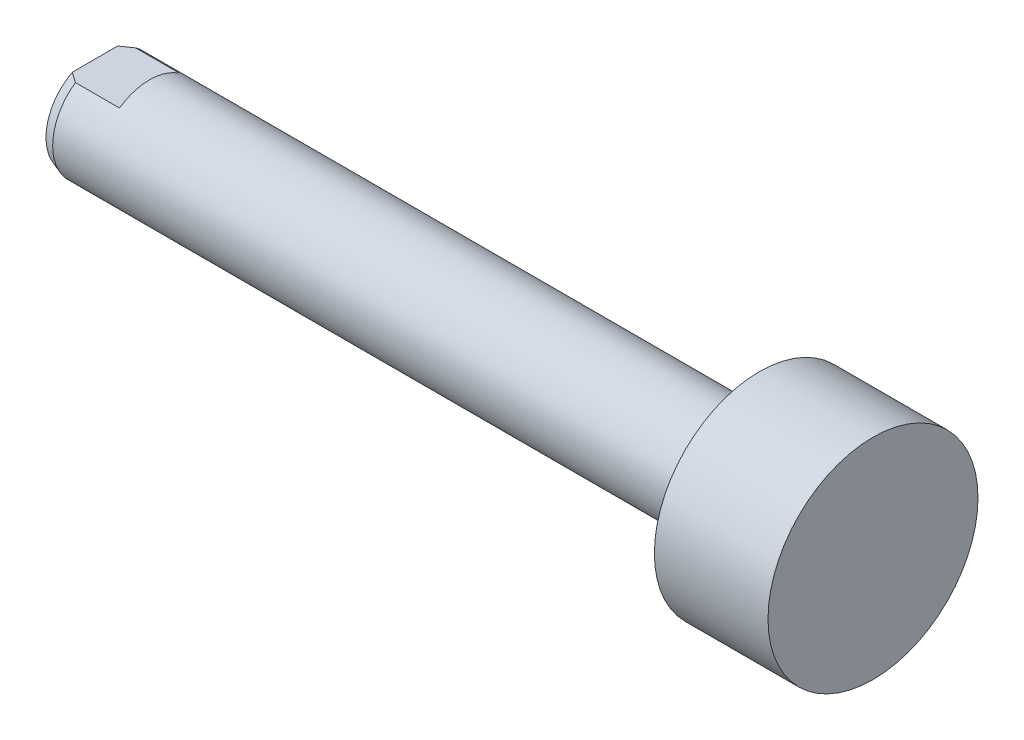
ISO-10303-21;
HEADER;
FILE_DESCRIPTION(('STEP AP214'),'2;1');
FILE_NAME('part.step','',(''),(''),'','','');
FILE_SCHEMA(('AUTOMOTIVE_DESIGN { 1 0 10303 214 1 1 1 1 }'));
ENDSEC;
DATA;
#1=APPLICATION_CONTEXT('core data for automotive mechanical design processes');
#2=APPLICATION_PROTOCOL_DEFINITION('international standard','automotive_design',2000,#1);
#3=PRODUCT_CONTEXT('',#1,'mechanical');
#4=PRODUCT('Part','Part','',(#3));
#5=PRODUCT_RELATED_PRODUCT_CATEGORY('part','',(#4));
#6=PRODUCT_DEFINITION_FORMATION('','',#4);
#7=PRODUCT_DEFINITION_CONTEXT('part definition',#1,'design');
#8=PRODUCT_DEFINITION('design','',#6,#7);
#9=PRODUCT_DEFINITION_SHAPE('','',#8);
#10=(LENGTH_UNIT() NAMED_UNIT(*) SI_UNIT(.MILLI.,.METRE.));
#11=(NAMED_UNIT(*) PLANE_ANGLE_UNIT() SI_UNIT($,.RADIAN.));
#12=(NAMED_UNIT(*) SI_UNIT($,.STERADIAN.) SOLID_ANGLE_UNIT());
#13=UNCERTAINTY_MEASURE_WITH_UNIT(LENGTH_MEASURE(1.E-05),#10,'distance_accuracy_value','');
#14=(GEOMETRIC_REPRESENTATION_CONTEXT(3) GLOBAL_UNCERTAINTY_ASSIGNED_CONTEXT((#13)) GLOBAL_UNIT_ASSIGNED_CONTEXT((#10,
#11,#12)) REPRESENTATION_CONTEXT('',''));
#15=CARTESIAN_POINT('',(0.,0.,0.));
#16=DIRECTION('',(0.,0.,1.));
#17=DIRECTION('',(1.,0.,0.));
#18=AXIS2_PLACEMENT_3D('',#15,#16,#17);
#19=CARTESIAN_POINT('',(2.11328000006006,0.,0.));
#20=DIRECTION('',(-1.,0.,0.));
#21=DIRECTION('',(0.,0.,1.));
#22=AXIS2_PLACEMENT_3D('',#19,#20,#21);
#23=CONICAL_SURFACE('',#22,1.22949999996536,1.04719755108378);
#24=CARTESIAN_POINT('',(2.8231321560952,8.5265128291212E-11,0.));
#25=VERTEX_POINT('',#24);
#26=VERTEX_LOOP('',#25);
#27=FACE_BOUND('',#26,.T.);
#28=CARTESIAN_POINT('',(2.11328,0.,0.));
#29=DIRECTION('',(1.,0.,0.));
#30=DIRECTION('',(0.,0.,-1.));
#31=AXIS2_PLACEMENT_3D('',#28,#29,#30);
#32=CIRCLE('',#31,1.2295);
#33=CARTESIAN_POINT('',(2.11328,0.,-1.2295));
#34=VERTEX_POINT('',#33);
#35=EDGE_CURVE('E77',#34,#34,#32,.F.);
#36=ORIENTED_EDGE('',*,*,#35,.T.);
#37=EDGE_LOOP('',(#36));
#38=FACE_BOUND('',#37,.T.);
#39=ADVANCED_FACE('F16',(#27,#38),#23,.F.);
#40=CARTESIAN_POINT('',(-1.34811,0.,0.));
#41=DIRECTION('',(1.,0.,0.));
#42=DIRECTION('',(0.,0.,-1.));
#43=AXIS2_PLACEMENT_3D('',#40,#41,#42);
#44=CYLINDRICAL_SURFACE('',#43,1.2295);
#45=CARTESIAN_POINT('',(-4.80950000002167,0.,0.));
#46=DIRECTION('',(-1.,0.,0.));
#47=DIRECTION('',(0.,1.,0.));
#48=AXIS2_PLACEMENT_3D('',#45,#46,#47);
#49=CIRCLE('',#48,1.2295000000222);
#50=CARTESIAN_POINT('',(-4.80950000002167,1.2295000000222,0.));
#51=VERTEX_POINT('',#50);
#52=EDGE_CURVE('E79',#51,#51,#49,.T.);
#53=ORIENTED_EDGE('',*,*,#52,.T.);
#54=EDGE_LOOP('',(#53));
#55=FACE_BOUND('',#54,.T.);
#56=ORIENTED_EDGE('',*,*,#35,.F.);
#57=EDGE_LOOP('',(#56));
#58=FACE_BOUND('',#57,.T.);
#59=ADVANCED_FACE('F74',(#55,#58),#44,.F.);
#60=CARTESIAN_POINT('',(39.09695,2.98094999999999,0.));
#61=DIRECTION('',(1.,0.,0.));
#62=DIRECTION('',(0.,0.,-1.));
#63=AXIS2_PLACEMENT_3D('',#60,#61,#62);
#64=PLANE('',#63);
#65=CARTESIAN_POINT('',(39.09695,0.,0.));
#66=DIRECTION('',(1.,0.,0.));
#67=DIRECTION('',(0.,0.,-1.));
#68=AXIS2_PLACEMENT_3D('',#65,#66,#67);
#69=CIRCLE('',#68,5.9619);
#70=CARTESIAN_POINT('',(39.09695,0.,-5.9619));
#71=VERTEX_POINT('',#70);
#72=EDGE_CURVE('E19',#71,#71,#69,.F.);
#73=ORIENTED_EDGE('',*,*,#72,.F.);
#74=EDGE_LOOP('',(#73));
#75=FACE_BOUND('',#74,.T.);
#76=ADVANCED_FACE('F138',(#75),#64,.T.);
#77=CARTESIAN_POINT('',(-5.08000000002085,0.,0.));
#78=DIRECTION('',(-1.,0.,0.));
#79=DIRECTION('',(0.,0.,1.));
#80=AXIS2_PLACEMENT_3D('',#77,#78,#79);
#81=CONICAL_SURFACE('',#80,1.50000000002137,0.785398163397448);
#82=CARTESIAN_POINT('',(-5.08000000002085,0.,0.));
#83=DIRECTION('',(-1.,0.,0.));
#84=DIRECTION('',(0.,0.,1.));
#85=AXIS2_PLACEMENT_3D('',#82,#83,#84);
#86=CIRCLE('',#85,1.50000000002137);
#87=CARTESIAN_POINT('',(-5.08000000002085,0.,1.50000000002137));
#88=VERTEX_POINT('',#87);
#89=EDGE_CURVE('E103',#88,#88,#86,.F.);
#90=ORIENTED_EDGE('',*,*,#89,.F.);
#91=EDGE_LOOP('',(#90));
#92=FACE_BOUND('',#91,.T.);
#93=ORIENTED_EDGE('',*,*,#52,.F.);
#94=EDGE_LOOP('',(#93));
#95=FACE_BOUND('',#94,.T.);
#96=ADVANCED_FACE('F134',(#92,#95),#81,.F.);
#97=CARTESIAN_POINT('',(35.87115,0.,0.));
#98=DIRECTION('',(1.,0.,0.));
#99=DIRECTION('',(0.,0.,-1.));
#100=AXIS2_PLACEMENT_3D('',#97,#98,#99);
#101=CYLINDRICAL_SURFACE('',#100,5.9619);
#102=CARTESIAN_POINT('',(32.64535,0.,0.));
#103=DIRECTION('',(1.,0.,0.));
#104=DIRECTION('',(0.,0.,-1.));
#105=AXIS2_PLACEMENT_3D('',#102,#103,#104);
#106=CIRCLE('',#105,5.9619);
#107=CARTESIAN_POINT('',(32.64535,0.,-5.9619));
#108=VERTEX_POINT('',#107);
#109=EDGE_CURVE('E97',#108,#108,#106,.F.);
#110=ORIENTED_EDGE('',*,*,#109,.F.);
#111=EDGE_LOOP('',(#110));
#112=FACE_BOUND('',#111,.T.);
#113=ORIENTED_EDGE('',*,*,#72,.T.);
#114=EDGE_LOOP('',(#113));
#115=FACE_BOUND('',#114,.T.);
#116=ADVANCED_FACE('F129',(#112,#115),#101,.T.);
#117=CARTESIAN_POINT('',(-4.48329518582113,0.,0.));
#118=DIRECTION('',(1.,0.,0.));
#119=DIRECTION('',(0.,0.,-1.));
#120=AXIS2_PLACEMENT_3D('',#117,#118,#119);
#121=CONICAL_SURFACE('',#120,2.99720000001003,0.349065850407162);
#122=CARTESIAN_POINT('',(-4.48329518582113,2.46380000000824,1.70672124262267));
#123=CARTESIAN_POINT('',(-4.51097913225117,2.46380000672184,1.68902577354891));
#124=CARTESIAN_POINT('',(-4.53857947804352,2.46380000758425,1.6711989698207));
#125=CARTESIAN_POINT('',(-4.59299465106385,2.46379998808494,1.63565422581739));
#126=CARTESIAN_POINT('',(-4.61981347488522,2.46379996818603,1.6179424017832));
#127=CARTESIAN_POINT('',(-4.6726658415024,2.46379989952958,1.58262352310495));
#128=CARTESIAN_POINT('',(-4.69870362829504,2.46379985142043,1.56502282422495));
#129=CARTESIAN_POINT('',(-4.74999352945157,2.46379975252432,1.52992132298173));
#130=CARTESIAN_POINT('',(-4.77525016731626,2.46379970182161,1.51242713384378));
#131=CARTESIAN_POINT('',(-4.82497753678573,2.46379962915132,1.47753368893592));
#132=CARTESIAN_POINT('',(-4.84945308740282,2.4637996065571,1.46014130547872));
#133=CARTESIAN_POINT('',(-4.8976179161575,2.46379961079501,1.42544618405401));
#134=CARTESIAN_POINT('',(-4.92131233208845,2.46379963650245,1.40815058252513));
#135=CARTESIAN_POINT('',(-4.96791477296314,2.46379973594677,1.37364366027284));
#136=CARTESIAN_POINT('',(-4.99082826971789,2.46379980855252,1.35643973728343));
#137=CARTESIAN_POINT('',(-5.03586779935474,2.46379993363123,1.32210998243675));
#138=CARTESIAN_POINT('',(-5.05799968162426,2.46379998653734,1.3049918214378));
#139=CARTESIAN_POINT('',(-5.07999999996649,2.46380000002124,1.28770541751564));
#140=B_SPLINE_CURVE_WITH_KNOTS('',3,(#122,#123,#124,#125,#126,#127,#128,#129,#130,#131,#132,
#133,#134,#135,#136,#137,#138,#139),.UNSPECIFIED.,.F.,.F.,(4,2,2,2,2,2,2,2,4),(0.,
0.0985686869377982,0.194986004301154,0.289269581323357,0.381438527237303,0.471513562401373,
0.559517161624862,0.645473710664596,0.729409676852239),.UNSPECIFIED.);
#141=CARTESIAN_POINT('',(-4.48329518581104,2.46380000000412,1.70672124261982));
#142=VERTEX_POINT('',#141);
#143=CARTESIAN_POINT('',(-5.07999999996524,2.46380000001062,1.28770541753693));
#144=VERTEX_POINT('',#143);
#145=EDGE_CURVE('E105',#142,#144,#140,.T.);
#146=ORIENTED_EDGE('',*,*,#145,.T.);
#147=CARTESIAN_POINT('',(-5.079999999964,0.,0.));
#148=DIRECTION('',(1.,0.,0.));
#149=DIRECTION('',(0.,0.,-1.));
#150=AXIS2_PLACEMENT_3D('',#147,#148,#149);
#151=CIRCLE('',#150,2.78001720901307);
#152=CARTESIAN_POINT('',(-5.07999999996524,-2.46380000001062,1.28770541753694));
#153=VERTEX_POINT('',#152);
#154=EDGE_CURVE('E101',#153,#144,#151,.F.);
#155=ORIENTED_EDGE('',*,*,#154,.F.);
#156=CARTESIAN_POINT('',(-5.07999999996649,-2.46380000002124,1.28770541751564));
#157=CARTESIAN_POINT('',(-5.05799968162427,-2.46379998653733,1.30499182143781));
#158=CARTESIAN_POINT('',(-5.03586779935475,-2.46379993363123,1.32210998243675));
#159=CARTESIAN_POINT('',(-4.99082826971789,-2.46379980855252,1.35643973728343));
#160=CARTESIAN_POINT('',(-4.96791477296314,-2.46379973594677,1.37364366027285));
#161=CARTESIAN_POINT('',(-4.92131233208845,-2.46379963650245,1.40815058252513));
#162=CARTESIAN_POINT('',(-4.8976179161575,-2.46379961079501,1.42544618405401));
#163=CARTESIAN_POINT('',(-4.84945308740282,-2.46379960655709,1.46014130547872));
#164=CARTESIAN_POINT('',(-4.82497753678573,-2.46379962915132,1.47753368893592));
#165=CARTESIAN_POINT('',(-4.77525016731626,-2.46379970182161,1.51242713384378));
#166=CARTESIAN_POINT('',(-4.74999352945157,-2.46379975252432,1.52992132298173));
#167=CARTESIAN_POINT('',(-4.69870362829504,-2.46379985142043,1.56502282422495));
#168=CARTESIAN_POINT('',(-4.6726658415024,-2.46379989952958,1.58262352310495));
#169=CARTESIAN_POINT('',(-4.61981347488522,-2.46379996818603,1.6179424017832));
#170=CARTESIAN_POINT('',(-4.59299465106385,-2.46379998808494,1.63565422581739));
#171=CARTESIAN_POINT('',(-4.53857947804352,-2.46380000758425,1.6711989698207));
#172=CARTESIAN_POINT('',(-4.51097913225117,-2.46380000672184,1.68902577354891));
#173=CARTESIAN_POINT('',(-4.48329518582113,-2.46380000000824,1.70672124262267));
#174=B_SPLINE_CURVE_WITH_KNOTS('',3,(#156,#157,#158,#159,#160,#161,#162,#163,#164,#165,#166,
#167,#168,#169,#170,#171,#172,#173),.UNSPECIFIED.,.F.,.F.,(4,2,2,2,2,2,2,2,4),(0.,
0.0839359661876431,0.169892515227376,0.257896114450867,0.347971149614936,0.440140095528881,
0.534423672551086,0.63084098991444,0.729409676852239),.UNSPECIFIED.);
#175=CARTESIAN_POINT('',(-4.48329518581104,-2.46380000000412,1.70672124261982));
#176=VERTEX_POINT('',#175);
#177=EDGE_CURVE('E68',#153,#176,#174,.T.);
#178=ORIENTED_EDGE('',*,*,#177,.T.);
#179=CARTESIAN_POINT('',(-4.48329518580094,0.,0.));
#180=DIRECTION('',(1.,0.,0.));
#181=DIRECTION('',(0.,0.,-1.));
#182=AXIS2_PLACEMENT_3D('',#179,#180,#181);
#183=CIRCLE('',#182,2.9972);
#184=EDGE_CURVE('E100',#142,#176,#183,.T.);
#185=ORIENTED_EDGE('',*,*,#184,.F.);
#186=EDGE_LOOP('',(#146,#155,#178,#185));
#187=FACE_BOUND('',#186,.T.);
#188=ADVANCED_FACE('F118',(#187),#121,.T.);
#189=CARTESIAN_POINT('',(-5.08,1.3900086044941,0.));
#190=DIRECTION('',(-1.,0.,0.));
#191=DIRECTION('',(0.,0.,1.));
#192=AXIS2_PLACEMENT_3D('',#189,#190,#191);
#193=PLANE('',#192);
#194=DIRECTION('',(0.,0.,-1.));
#195=VECTOR('',#194,1.);
#196=CARTESIAN_POINT('',(-5.08,2.4638,-5.9944));
#197=LINE('',#196,#195);
#198=CARTESIAN_POINT('',(-5.079999999964,2.46380000001102,-1.28770541753714));
#199=VERTEX_POINT('',#198);
#200=EDGE_CURVE('E173',#144,#199,#197,.T.);
#201=ORIENTED_EDGE('',*,*,#200,.T.);
#202=CARTESIAN_POINT('',(-5.079999999964,0.,0.));
#203=DIRECTION('',(1.,0.,0.));
#204=DIRECTION('',(0.,0.,-1.));
#205=AXIS2_PLACEMENT_3D('',#202,#203,#204);
#206=CIRCLE('',#205,2.78001720901307);
#207=CARTESIAN_POINT('',(-5.079999999964,-2.46380000001102,-1.28770541753714));
#208=VERTEX_POINT('',#207);
#209=EDGE_CURVE('E92',#208,#199,#206,.T.);
#210=ORIENTED_EDGE('',*,*,#209,.F.);
#211=DIRECTION('',(0.,0.,1.));
#212=VECTOR('',#211,1.);
#213=CARTESIAN_POINT('',(-5.08,-2.4638,5.9944));
#214=LINE('',#213,#212);
#215=EDGE_CURVE('E182',#208,#153,#214,.T.);
#216=ORIENTED_EDGE('',*,*,#215,.T.);
#217=ORIENTED_EDGE('',*,*,#154,.T.);
#218=EDGE_LOOP('',(#201,#210,#216,#217));
#219=FACE_BOUND('',#218,.T.);
#220=ORIENTED_EDGE('',*,*,#89,.T.);
#221=EDGE_LOOP('',(#220));
#222=FACE_BOUND('',#221,.T.);
#223=ADVANCED_FACE('F128',(#219,#222),#193,.T.);
#224=CARTESIAN_POINT('',(32.64535,4.47954999999999,0.));
#225=DIRECTION('',(-1.,0.,0.));
#226=DIRECTION('',(0.,0.,1.));
#227=AXIS2_PLACEMENT_3D('',#224,#225,#226);
#228=PLANE('',#227);
#229=ORIENTED_EDGE('',*,*,#109,.T.);
#230=EDGE_LOOP('',(#229));
#231=FACE_BOUND('',#230,.T.);
#232=CARTESIAN_POINT('',(32.64535,0.,0.));
#233=DIRECTION('',(1.,0.,0.));
#234=DIRECTION('',(0.,0.,-1.));
#235=AXIS2_PLACEMENT_3D('',#232,#233,#234);
#236=CIRCLE('',#235,2.9972);
#237=CARTESIAN_POINT('',(32.64535,0.,-2.9972));
#238=VERTEX_POINT('',#237);
#239=EDGE_CURVE('E89',#238,#238,#236,.F.);
#240=ORIENTED_EDGE('',*,*,#239,.F.);
#241=EDGE_LOOP('',(#240));
#242=FACE_BOUND('',#241,.T.);
#243=ADVANCED_FACE('F205',(#231,#242),#228,.T.);
#244=CARTESIAN_POINT('',(-1.9812,0.,0.));
#245=DIRECTION('',(1.,0.,0.));
#246=DIRECTION('',(0.,0.,-1.));
#247=AXIS2_PLACEMENT_3D('',#244,#245,#246);
#248=PLANE('',#247);
#249=DIRECTION('',(0.,0.,1.));
#250=VECTOR('',#249,1.);
#251=CARTESIAN_POINT('',(-1.9812,-2.4638,5.9944));
#252=LINE('',#251,#250);
#253=CARTESIAN_POINT('',(-1.9812,-2.4638,1.70672124261696));
#254=VERTEX_POINT('',#253);
#255=CARTESIAN_POINT('',(-1.9812,-2.4638,-1.70672124261696));
#256=VERTEX_POINT('',#255);
#257=EDGE_CURVE('E174',#254,#256,#252,.F.);
#258=ORIENTED_EDGE('',*,*,#257,.T.);
#259=CARTESIAN_POINT('',(-1.9812,0.,0.));
#260=DIRECTION('',(1.,0.,0.));
#261=DIRECTION('',(0.,0.,-1.));
#262=AXIS2_PLACEMENT_3D('',#259,#260,#261);
#263=CIRCLE('',#262,2.9972);
#264=EDGE_CURVE('E85',#254,#256,#263,.T.);
#265=ORIENTED_EDGE('',*,*,#264,.F.);
#266=EDGE_LOOP('',(#258,#265));
#267=FACE_BOUND('',#266,.T.);
#268=ADVANCED_FACE('F209',(#267),#248,.F.);
#269=CARTESIAN_POINT('',(-5.08,-2.4638,5.9944));
#270=DIRECTION('',(0.,1.,0.));
#271=DIRECTION('',(0.,0.,1.));
#272=AXIS2_PLACEMENT_3D('',#269,#270,#271);
#273=PLANE('',#272);
#274=DIRECTION('',(1.,0.,0.));
#275=VECTOR('',#274,1.);
#276=CARTESIAN_POINT('',(14.0810274070995,-2.4638,-1.70672124261696));
#277=LINE('',#276,#275);
#278=CARTESIAN_POINT('',(-4.48329518581104,-2.46380000000412,-1.70672124261982));
#279=VERTEX_POINT('',#278);
#280=EDGE_CURVE('E88',#256,#279,#277,.F.);
#281=ORIENTED_EDGE('',*,*,#280,.F.);
#282=ORIENTED_EDGE('',*,*,#257,.F.);
#283=DIRECTION('',(1.,0.,0.));
#284=VECTOR('',#283,1.);
#285=CARTESIAN_POINT('',(-5.08,-2.4638,1.70672124261696));
#286=LINE('',#285,#284);
#287=EDGE_CURVE('E186',#176,#254,#286,.T.);
#288=ORIENTED_EDGE('',*,*,#287,.F.);
#289=ORIENTED_EDGE('',*,*,#177,.F.);
#290=ORIENTED_EDGE('',*,*,#215,.F.);
#291=CARTESIAN_POINT('',(-4.48329518582113,-2.46380000000824,-1.70672124262267));
#292=CARTESIAN_POINT('',(-4.51097913225117,-2.46380000672184,-1.68902577354891));
#293=CARTESIAN_POINT('',(-4.53857947804352,-2.46380000758425,-1.67119896982069));
#294=CARTESIAN_POINT('',(-4.59299465106385,-2.46379998808494,-1.63565422581738));
#295=CARTESIAN_POINT('',(-4.61981347488522,-2.46379996818604,-1.61794240178319));
#296=CARTESIAN_POINT('',(-4.6726658415024,-2.46379989952959,-1.58262352310495));
#297=CARTESIAN_POINT('',(-4.69870362829505,-2.46379985142043,-1.56502282422495));
#298=CARTESIAN_POINT('',(-4.74999352945157,-2.46379975252432,-1.52992132298173));
#299=CARTESIAN_POINT('',(-4.77525016731626,-2.46379970182161,-1.51242713384378));
#300=CARTESIAN_POINT('',(-4.82497753678573,-2.46379962915132,-1.47753368893591));
#301=CARTESIAN_POINT('',(-4.84945308740283,-2.4637996065571,-1.46014130547872));
#302=CARTESIAN_POINT('',(-4.8976179161575,-2.46379961079501,-1.42544618405401));
#303=CARTESIAN_POINT('',(-4.92131233208845,-2.46379963650245,-1.40815058252513));
#304=CARTESIAN_POINT('',(-4.96791477296314,-2.46379973594677,-1.37364366027284));
#305=CARTESIAN_POINT('',(-4.99082826971789,-2.46379980855252,-1.35643973728343));
#306=CARTESIAN_POINT('',(-5.03586779935474,-2.46379993363123,-1.32210998243675));
#307=CARTESIAN_POINT('',(-5.05799968162427,-2.46379998653734,-1.3049918214378));
#308=CARTESIAN_POINT('',(-5.07999999996649,-2.46380000002124,-1.28770541751564));
#309=B_SPLINE_CURVE_WITH_KNOTS('',3,(#291,#292,#293,#294,#295,#296,#297,#298,#299,#300,#301,
#302,#303,#304,#305,#306,#307,#308),.UNSPECIFIED.,.F.,.F.,(4,2,2,2,2,2,2,2,4),(0.,
0.0985686869378002,0.194986004301155,0.289269581323358,0.381438527237304,0.471513562401374,
0.559517161624864,0.645473710664597,0.729409676852239),.UNSPECIFIED.);
#310=EDGE_CURVE('E96',#279,#208,#309,.T.);
#311=ORIENTED_EDGE('',*,*,#310,.F.);
#312=EDGE_LOOP('',(#281,#282,#288,#289,#290,#311));
#313=FACE_BOUND('',#312,.T.);
#314=ADVANCED_FACE('F165',(#313),#273,.F.);
#315=CARTESIAN_POINT('',(-4.48329518582113,0.,0.));
#316=DIRECTION('',(1.,0.,0.));
#317=DIRECTION('',(0.,0.,-1.));
#318=AXIS2_PLACEMENT_3D('',#315,#316,#317);
#319=CONICAL_SURFACE('',#318,2.99720000001003,0.349065850407162);
#320=CARTESIAN_POINT('',(-5.08000000000378,2.46380000000921,-1.28770541750935));
#321=CARTESIAN_POINT('',(-5.05799968166768,2.46379998652628,-1.30499182142484));
#322=CARTESIAN_POINT('',(-5.03586779940431,2.46379993362126,-1.32210998241711));
#323=CARTESIAN_POINT('',(-4.99082826977739,2.46379980854484,-1.35643973725242));
#324=CARTESIAN_POINT('',(-4.96791477302641,2.4637997359403,-1.3736436602371));
#325=CARTESIAN_POINT('',(-4.9213123321569,2.46379963649843,-1.40815058248193));
#326=CARTESIAN_POINT('',(-4.89761791622734,2.46379961079221,-1.42544618400806));
#327=CARTESIAN_POINT('',(-4.84945308747309,2.46379960655664,-1.46014130542931));
#328=CARTESIAN_POINT('',(-4.82497753685502,2.46379962915199,-1.47753368888577));
#329=CARTESIAN_POINT('',(-4.77525016738121,2.4637997018243,-1.51242713379423));
#330=CARTESIAN_POINT('',(-4.74999352951316,2.46379975252789,-1.52992132293349));
#331=CARTESIAN_POINT('',(-4.69870362834755,2.46379985142545,-1.56502282418144));
#332=CARTESIAN_POINT('',(-4.67266584154917,2.46379989953514,-1.58262352306483));
#333=CARTESIAN_POINT('',(-4.61981347491815,2.4637999681922,-1.617942401752));
#334=CARTESIAN_POINT('',(-4.59299465108867,2.46379998809117,-1.6356542257917));
#335=CARTESIAN_POINT('',(-4.53857947804975,2.46380000759004,-1.67119896980819));
#336=CARTESIAN_POINT('',(-4.5109791322469,2.46380000672709,-1.68902577354405));
#337=CARTESIAN_POINT('',(-4.48329518580652,2.46380000001261,-1.7067212426257));
#338=B_SPLINE_CURVE_WITH_KNOTS('',3,(#320,#321,#322,#323,#324,#325,#326,#327,#328,#329,#330,
#331,#332,#333,#334,#335,#336,#337),.UNSPECIFIED.,.F.,.F.,(4,2,2,2,2,2,2,2,4),(0.,
0.0839359661608174,0.169892515182991,0.257896114398242,0.347971149563442,0.440140095487922,
0.534423672530092,0.63084098992287,0.729409676899567),.UNSPECIFIED.);
#339=CARTESIAN_POINT('',(-4.48329518580373,2.46380000000631,-1.70672124262133));
#340=VERTEX_POINT('',#339);
#341=EDGE_CURVE('E170',#199,#340,#338,.T.);
#342=ORIENTED_EDGE('',*,*,#341,.T.);
#343=CARTESIAN_POINT('',(-4.48329518580094,0.,0.));
#344=DIRECTION('',(1.,0.,0.));
#345=DIRECTION('',(0.,0.,-1.));
#346=AXIS2_PLACEMENT_3D('',#343,#344,#345);
#347=CIRCLE('',#346,2.9972);
#348=EDGE_CURVE('E193',#279,#340,#347,.T.);
#349=ORIENTED_EDGE('',*,*,#348,.F.);
#350=ORIENTED_EDGE('',*,*,#310,.T.);
#351=ORIENTED_EDGE('',*,*,#209,.T.);
#352=EDGE_LOOP('',(#342,#349,#350,#351));
#353=FACE_BOUND('',#352,.T.);
#354=ADVANCED_FACE('F161',(#353),#319,.T.);
#355=CARTESIAN_POINT('',(-5.08,2.4638,-5.9944));
#356=DIRECTION('',(0.,-1.,0.));
#357=DIRECTION('',(0.,0.,-1.));
#358=AXIS2_PLACEMENT_3D('',#355,#356,#357);
#359=PLANE('',#358);
#360=ORIENTED_EDGE('',*,*,#200,.F.);
#361=ORIENTED_EDGE('',*,*,#145,.F.);
#362=DIRECTION('',(1.,0.,0.));
#363=VECTOR('',#362,1.);
#364=CARTESIAN_POINT('',(-5.08,2.4638,1.70672124261696));
#365=LINE('',#364,#363);
#366=CARTESIAN_POINT('',(-1.9812,2.4638,1.70672124261696));
#367=VERTEX_POINT('',#366);
#368=EDGE_CURVE('E95',#367,#142,#365,.F.);
#369=ORIENTED_EDGE('',*,*,#368,.F.);
#370=DIRECTION('',(0.,0.,-1.));
#371=VECTOR('',#370,1.);
#372=CARTESIAN_POINT('',(-1.9812,2.4638,0.));
#373=LINE('',#372,#371);
#374=CARTESIAN_POINT('',(-1.9812,2.4638,-1.70672124261696));
#375=VERTEX_POINT('',#374);
#376=EDGE_CURVE('E34',#367,#375,#373,.T.);
#377=ORIENTED_EDGE('',*,*,#376,.T.);
#378=DIRECTION('',(1.,0.,0.));
#379=VECTOR('',#378,1.);
#380=CARTESIAN_POINT('',(14.0810274070995,2.4638,-1.70672124261696));
#381=LINE('',#380,#379);
#382=EDGE_CURVE('E25',#340,#375,#381,.T.);
#383=ORIENTED_EDGE('',*,*,#382,.F.);
#384=ORIENTED_EDGE('',*,*,#341,.F.);
#385=EDGE_LOOP('',(#360,#361,#369,#377,#383,#384));
#386=FACE_BOUND('',#385,.T.);
#387=ADVANCED_FACE('F155',(#386),#359,.F.);
#388=CARTESIAN_POINT('',(-1.9812,0.,0.));
#389=DIRECTION('',(1.,0.,0.));
#390=DIRECTION('',(0.,0.,-1.));
#391=AXIS2_PLACEMENT_3D('',#388,#389,#390);
#392=PLANE('',#391);
#393=ORIENTED_EDGE('',*,*,#376,.F.);
#394=CARTESIAN_POINT('',(-1.9812,0.,0.));
#395=DIRECTION('',(1.,0.,0.));
#396=DIRECTION('',(0.,0.,-1.));
#397=AXIS2_PLACEMENT_3D('',#394,#395,#396);
#398=CIRCLE('',#397,2.9972);
#399=EDGE_CURVE('E10',#375,#367,#398,.T.);
#400=ORIENTED_EDGE('',*,*,#399,.F.);
#401=EDGE_LOOP('',(#393,#400));
#402=FACE_BOUND('',#401,.T.);
#403=ADVANCED_FACE('F149',(#402),#392,.F.);
#404=CARTESIAN_POINT('',(14.0810274070995,0.,0.));
#405=DIRECTION('',(1.,0.,0.));
#406=DIRECTION('',(0.,0.,-1.));
#407=AXIS2_PLACEMENT_3D('',#404,#405,#406);
#408=CYLINDRICAL_SURFACE('',#407,2.9972);
#409=ORIENTED_EDGE('',*,*,#239,.T.);
#410=EDGE_LOOP('',(#409));
#411=FACE_BOUND('',#410,.T.);
#412=ORIENTED_EDGE('',*,*,#382,.T.);
#413=ORIENTED_EDGE('',*,*,#399,.T.);
#414=ORIENTED_EDGE('',*,*,#368,.T.);
#415=ORIENTED_EDGE('',*,*,#184,.T.);
#416=ORIENTED_EDGE('',*,*,#287,.T.);
#417=ORIENTED_EDGE('',*,*,#264,.T.);
#418=ORIENTED_EDGE('',*,*,#280,.T.);
#419=ORIENTED_EDGE('',*,*,#348,.T.);
#420=EDGE_LOOP('',(#412,#413,#414,#415,#416,#417,#418,#419));
#421=FACE_BOUND('',#420,.T.);
#422=ADVANCED_FACE('F147',(#411,#421),#408,.T.);
#423=CLOSED_SHELL('',(#39,#59,#76,#96,#116,#188,#223,#243,#268,#314,#354,#387,#403,#422));
#424=MANIFOLD_SOLID_BREP('B1',#423);
#425=ADVANCED_BREP_SHAPE_REPRESENTATION('',(#18,#424),#14);
#426=SHAPE_DEFINITION_REPRESENTATION(#9,#425);
ENDSEC;
END-ISO-10303-21;
